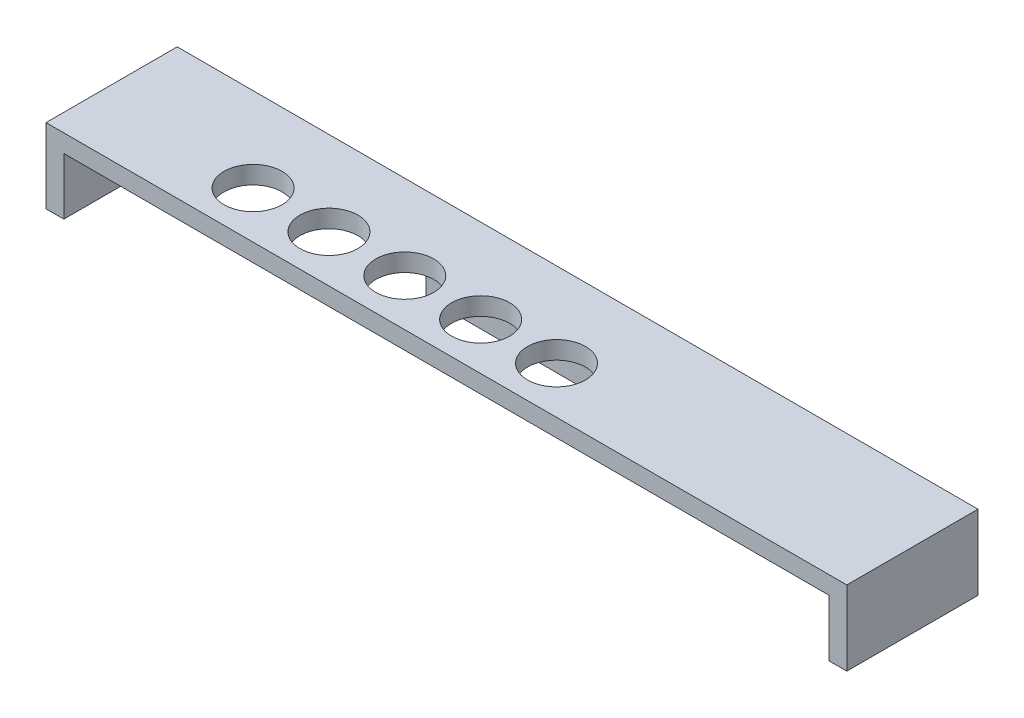
ISO-10303-21;
HEADER;
FILE_DESCRIPTION(('STEP AP214'),'2;1');
FILE_NAME('part.step','',(''),(''),'','','');
FILE_SCHEMA(('AUTOMOTIVE_DESIGN { 1 0 10303 214 1 1 1 1 }'));
ENDSEC;
DATA;
#1=APPLICATION_CONTEXT('core data for automotive mechanical design processes');
#2=APPLICATION_PROTOCOL_DEFINITION('international standard','automotive_design',2000,#1);
#3=PRODUCT_CONTEXT('',#1,'mechanical');
#4=PRODUCT('Part','Part','',(#3));
#5=PRODUCT_RELATED_PRODUCT_CATEGORY('part','',(#4));
#6=PRODUCT_DEFINITION_FORMATION('','',#4);
#7=PRODUCT_DEFINITION_CONTEXT('part definition',#1,'design');
#8=PRODUCT_DEFINITION('design','',#6,#7);
#9=PRODUCT_DEFINITION_SHAPE('','',#8);
#10=(LENGTH_UNIT() NAMED_UNIT(*) SI_UNIT(.MILLI.,.METRE.));
#11=(NAMED_UNIT(*) PLANE_ANGLE_UNIT() SI_UNIT($,.RADIAN.));
#12=(NAMED_UNIT(*) SI_UNIT($,.STERADIAN.) SOLID_ANGLE_UNIT());
#13=UNCERTAINTY_MEASURE_WITH_UNIT(LENGTH_MEASURE(1.E-05),#10,'distance_accuracy_value','');
#14=(GEOMETRIC_REPRESENTATION_CONTEXT(3) GLOBAL_UNCERTAINTY_ASSIGNED_CONTEXT((#13)) GLOBAL_UNIT_ASSIGNED_CONTEXT((#10,
#11,#12)) REPRESENTATION_CONTEXT('',''));
#15=CARTESIAN_POINT('',(0.,0.,0.));
#16=DIRECTION('',(0.,0.,1.));
#17=DIRECTION('',(1.,0.,0.));
#18=AXIS2_PLACEMENT_3D('',#15,#16,#17);
#19=CARTESIAN_POINT('',(0.,0.,0.));
#20=DIRECTION('',(0.,-1.,0.));
#21=DIRECTION('',(0.,0.,-1.));
#22=AXIS2_PLACEMENT_3D('',#19,#20,#21);
#23=PLANE('',#22);
#24=DIRECTION('',(1.,0.,0.));
#25=VECTOR('',#24,1.);
#26=CARTESIAN_POINT('',(87.725,0.,-12.7));
#27=LINE('',#26,#25);
#28=CARTESIAN_POINT('',(59.8625,0.,-12.7));
#29=VERTEX_POINT('',#28);
#30=CARTESIAN_POINT('',(87.725,0.,-12.7));
#31=VERTEX_POINT('',#30);
#32=EDGE_CURVE('E76',#29,#31,#27,.T.);
#33=ORIENTED_EDGE('',*,*,#32,.F.);
#34=DIRECTION('',(0.,0.,1.));
#35=VECTOR('',#34,1.);
#36=CARTESIAN_POINT('',(59.8625,0.,-14.7));
#37=LINE('',#36,#35);
#38=CARTESIAN_POINT('',(59.8625,0.,-14.7));
#39=VERTEX_POINT('',#38);
#40=EDGE_CURVE('E172',#39,#29,#37,.T.);
#41=ORIENTED_EDGE('',*,*,#40,.F.);
#42=DIRECTION('',(-1.,0.,0.));
#43=VECTOR('',#42,1.);
#44=CARTESIAN_POINT('',(0.,0.,-14.7));
#45=LINE('',#44,#43);
#46=CARTESIAN_POINT('',(87.725,0.,-14.7));
#47=VERTEX_POINT('',#46);
#48=EDGE_CURVE('E268',#47,#39,#45,.T.);
#49=ORIENTED_EDGE('',*,*,#48,.F.);
#50=DIRECTION('',(0.,0.,-1.));
#51=VECTOR('',#50,1.);
#52=CARTESIAN_POINT('',(87.725,0.,-14.7));
#53=LINE('',#52,#51);
#54=EDGE_CURVE('E11',#31,#47,#53,.T.);
#55=ORIENTED_EDGE('',*,*,#54,.F.);
#56=EDGE_LOOP('',(#33,#41,#49,#55));
#57=FACE_BOUND('',#56,.T.);
#58=ADVANCED_FACE('F38',(#57),#23,.T.);
#59=CARTESIAN_POINT('',(29.8625,0.,-14.7));
#60=VERTEX_POINT('',#59);
#61=CARTESIAN_POINT('',(2.,0.,-14.7));
#62=VERTEX_POINT('',#61);
#63=EDGE_CURVE('E278',#60,#62,#45,.T.);
#64=ORIENTED_EDGE('',*,*,#63,.F.);
#65=DIRECTION('',(0.,0.,-1.));
#66=VECTOR('',#65,1.);
#67=CARTESIAN_POINT('',(29.8625,0.,-14.7));
#68=LINE('',#67,#66);
#69=CARTESIAN_POINT('',(29.8625,0.,-12.7));
#70=VERTEX_POINT('',#69);
#71=EDGE_CURVE('E168',#70,#60,#68,.T.);
#72=ORIENTED_EDGE('',*,*,#71,.F.);
#73=CARTESIAN_POINT('',(2.,0.,-12.7));
#74=VERTEX_POINT('',#73);
#75=EDGE_CURVE('E275',#74,#70,#27,.T.);
#76=ORIENTED_EDGE('',*,*,#75,.F.);
#77=DIRECTION('',(0.,0.,1.));
#78=VECTOR('',#77,1.);
#79=CARTESIAN_POINT('',(2.,0.,-14.7));
#80=LINE('',#79,#78);
#81=EDGE_CURVE('E173',#62,#74,#80,.T.);
#82=ORIENTED_EDGE('',*,*,#81,.F.);
#83=EDGE_LOOP('',(#64,#72,#76,#82));
#84=FACE_BOUND('',#83,.T.);
#85=ADVANCED_FACE('F313',(#84),#23,.T.);
#86=CARTESIAN_POINT('',(2.,3.96875,-12.7));
#87=DIRECTION('',(-1.,0.,0.));
#88=DIRECTION('',(0.,0.,1.));
#89=AXIS2_PLACEMENT_3D('',#86,#87,#88);
#90=PLANE('',#89);
#91=DIRECTION('',(0.,-1.,0.));
#92=VECTOR('',#91,1.);
#93=CARTESIAN_POINT('',(2.,3.96875,0.));
#94=LINE('',#93,#92);
#95=CARTESIAN_POINT('',(2.,3.96875,0.));
#96=VERTEX_POINT('',#95);
#97=CARTESIAN_POINT('',(2.,-2.4,0.));
#98=VERTEX_POINT('',#97);
#99=EDGE_CURVE('E42',#96,#98,#94,.T.);
#100=ORIENTED_EDGE('',*,*,#99,.T.);
#101=DIRECTION('',(0.,0.,1.));
#102=VECTOR('',#101,1.);
#103=CARTESIAN_POINT('',(2.,-2.4,-14.7));
#104=LINE('',#103,#102);
#105=CARTESIAN_POINT('',(2.,-2.4,-14.7));
#106=VERTEX_POINT('',#105);
#107=EDGE_CURVE('E185',#106,#98,#104,.T.);
#108=ORIENTED_EDGE('',*,*,#107,.F.);
#109=DIRECTION('',(0.,1.,0.));
#110=VECTOR('',#109,1.);
#111=CARTESIAN_POINT('',(2.,-2.4,-14.7));
#112=LINE('',#111,#110);
#113=EDGE_CURVE('E190',#106,#62,#112,.T.);
#114=ORIENTED_EDGE('',*,*,#113,.T.);
#115=ORIENTED_EDGE('',*,*,#81,.T.);
#116=DIRECTION('',(0.,-1.,0.));
#117=VECTOR('',#116,1.);
#118=CARTESIAN_POINT('',(2.,3.96875,-12.7));
#119=LINE('',#118,#117);
#120=CARTESIAN_POINT('',(2.,3.96875,-12.7));
#121=VERTEX_POINT('',#120);
#122=EDGE_CURVE('E289',#121,#74,#119,.T.);
#123=ORIENTED_EDGE('',*,*,#122,.F.);
#124=DIRECTION('',(0.,0.,-1.));
#125=VECTOR('',#124,1.);
#126=CARTESIAN_POINT('',(2.,3.96875,-12.7));
#127=LINE('',#126,#125);
#128=EDGE_CURVE('E264',#96,#121,#127,.T.);
#129=ORIENTED_EDGE('',*,*,#128,.F.);
#130=EDGE_LOOP('',(#100,#108,#114,#115,#123,#129));
#131=FACE_BOUND('',#130,.T.);
#132=ADVANCED_FACE('F40',(#131),#90,.F.);
#133=CARTESIAN_POINT('',(87.725,3.96875,-12.7));
#134=DIRECTION('',(0.,0.,-1.));
#135=DIRECTION('',(-1.,0.,0.));
#136=AXIS2_PLACEMENT_3D('',#133,#134,#135);
#137=PLANE('',#136);
#138=ORIENTED_EDGE('',*,*,#75,.T.);
#139=DIRECTION('',(0.,1.,0.));
#140=VECTOR('',#139,1.);
#141=CARTESIAN_POINT('',(29.8625,-2.4,-12.7));
#142=LINE('',#141,#140);
#143=CARTESIAN_POINT('',(29.8625,-2.4,-12.7));
#144=VERTEX_POINT('',#143);
#145=EDGE_CURVE('E157',#144,#70,#142,.T.);
#146=ORIENTED_EDGE('',*,*,#145,.F.);
#147=DIRECTION('',(-1.,0.,0.));
#148=VECTOR('',#147,1.);
#149=CARTESIAN_POINT('',(59.8625,-2.4,-12.7));
#150=LINE('',#149,#148);
#151=CARTESIAN_POINT('',(59.8625,-2.4,-12.7));
#152=VERTEX_POINT('',#151);
#153=EDGE_CURVE('E150',#152,#144,#150,.T.);
#154=ORIENTED_EDGE('',*,*,#153,.F.);
#155=DIRECTION('',(0.,1.,0.));
#156=VECTOR('',#155,1.);
#157=CARTESIAN_POINT('',(59.8625,-2.4,-12.7));
#158=LINE('',#157,#156);
#159=EDGE_CURVE('E155',#152,#29,#158,.T.);
#160=ORIENTED_EDGE('',*,*,#159,.T.);
#161=ORIENTED_EDGE('',*,*,#32,.T.);
#162=DIRECTION('',(0.,-1.,0.));
#163=VECTOR('',#162,1.);
#164=CARTESIAN_POINT('',(87.725,3.96875,-12.7));
#165=LINE('',#164,#163);
#166=CARTESIAN_POINT('',(87.725,3.96875,-12.7));
#167=VERTEX_POINT('',#166);
#168=EDGE_CURVE('E66',#167,#31,#165,.T.);
#169=ORIENTED_EDGE('',*,*,#168,.F.);
#170=DIRECTION('',(1.,0.,0.));
#171=VECTOR('',#170,1.);
#172=CARTESIAN_POINT('',(87.725,3.96875,-12.7));
#173=LINE('',#172,#171);
#174=EDGE_CURVE('E267',#121,#167,#173,.T.);
#175=ORIENTED_EDGE('',*,*,#174,.F.);
#176=ORIENTED_EDGE('',*,*,#122,.T.);
#177=EDGE_LOOP('',(#138,#146,#154,#160,#161,#169,#175,#176));
#178=FACE_BOUND('',#177,.T.);
#179=ADVANCED_FACE('F153',(#178),#137,.F.);
#180=CARTESIAN_POINT('',(87.725,3.96875,0.));
#181=DIRECTION('',(1.,0.,0.));
#182=DIRECTION('',(0.,0.,-1.));
#183=AXIS2_PLACEMENT_3D('',#180,#181,#182);
#184=PLANE('',#183);
#185=ORIENTED_EDGE('',*,*,#168,.T.);
#186=ORIENTED_EDGE('',*,*,#54,.T.);
#187=DIRECTION('',(0.,1.,0.));
#188=VECTOR('',#187,1.);
#189=CARTESIAN_POINT('',(87.725,-2.4,-14.7));
#190=LINE('',#189,#188);
#191=CARTESIAN_POINT('',(87.725,-2.4,-14.7));
#192=VERTEX_POINT('',#191);
#193=EDGE_CURVE('E204',#192,#47,#190,.T.);
#194=ORIENTED_EDGE('',*,*,#193,.F.);
#195=DIRECTION('',(0.,0.,-1.));
#196=VECTOR('',#195,1.);
#197=CARTESIAN_POINT('',(87.725,-2.4,-14.7));
#198=LINE('',#197,#196);
#199=CARTESIAN_POINT('',(87.725,-2.4,0.));
#200=VERTEX_POINT('',#199);
#201=EDGE_CURVE('E200',#200,#192,#198,.T.);
#202=ORIENTED_EDGE('',*,*,#201,.F.);
#203=DIRECTION('',(0.,-1.,0.));
#204=VECTOR('',#203,1.);
#205=CARTESIAN_POINT('',(87.725,3.96875,0.));
#206=LINE('',#205,#204);
#207=CARTESIAN_POINT('',(87.725,3.96875,0.));
#208=VERTEX_POINT('',#207);
#209=EDGE_CURVE('E85',#208,#200,#206,.T.);
#210=ORIENTED_EDGE('',*,*,#209,.F.);
#211=DIRECTION('',(0.,0.,1.));
#212=VECTOR('',#211,1.);
#213=CARTESIAN_POINT('',(87.725,3.96875,0.));
#214=LINE('',#213,#212);
#215=EDGE_CURVE('E272',#167,#208,#214,.T.);
#216=ORIENTED_EDGE('',*,*,#215,.F.);
#217=EDGE_LOOP('',(#185,#186,#194,#202,#210,#216));
#218=FACE_BOUND('',#217,.T.);
#219=ADVANCED_FACE('F331',(#218),#184,.F.);
#220=CARTESIAN_POINT('',(89.725,3.96875,0.));
#221=DIRECTION('',(0.,0.,-1.));
#222=DIRECTION('',(-1.,0.,0.));
#223=AXIS2_PLACEMENT_3D('',#220,#221,#222);
#224=PLANE('',#223);
#225=ORIENTED_EDGE('',*,*,#209,.T.);
#226=DIRECTION('',(-1.,0.,0.));
#227=VECTOR('',#226,1.);
#228=CARTESIAN_POINT('',(89.725,-2.4,0.));
#229=LINE('',#228,#227);
#230=CARTESIAN_POINT('',(89.725,-2.4,0.));
#231=VERTEX_POINT('',#230);
#232=EDGE_CURVE('E197',#231,#200,#229,.T.);
#233=ORIENTED_EDGE('',*,*,#232,.F.);
#234=DIRECTION('',(0.,-1.,0.));
#235=VECTOR('',#234,1.);
#236=CARTESIAN_POINT('',(89.725,3.96875,0.));
#237=LINE('',#236,#235);
#238=CARTESIAN_POINT('',(89.725,5.96875,0.));
#239=VERTEX_POINT('',#238);
#240=EDGE_CURVE('E286',#239,#231,#237,.T.);
#241=ORIENTED_EDGE('',*,*,#240,.F.);
#242=DIRECTION('',(1.,0.,0.));
#243=VECTOR('',#242,1.);
#244=CARTESIAN_POINT('',(0.,5.96875,0.));
#245=LINE('',#244,#243);
#246=CARTESIAN_POINT('',(0.,5.96875,0.));
#247=VERTEX_POINT('',#246);
#248=EDGE_CURVE('E250',#247,#239,#245,.T.);
#249=ORIENTED_EDGE('',*,*,#248,.F.);
#250=DIRECTION('',(0.,-1.,0.));
#251=VECTOR('',#250,1.);
#252=CARTESIAN_POINT('',(0.,3.96875,0.));
#253=LINE('',#252,#251);
#254=CARTESIAN_POINT('',(0.,-2.4,0.));
#255=VERTEX_POINT('',#254);
#256=EDGE_CURVE('E274',#247,#255,#253,.T.);
#257=ORIENTED_EDGE('',*,*,#256,.T.);
#258=DIRECTION('',(-1.,0.,0.));
#259=VECTOR('',#258,1.);
#260=CARTESIAN_POINT('',(0.,-2.4,0.));
#261=LINE('',#260,#259);
#262=EDGE_CURVE('E188',#98,#255,#261,.T.);
#263=ORIENTED_EDGE('',*,*,#262,.F.);
#264=ORIENTED_EDGE('',*,*,#99,.F.);
#265=DIRECTION('',(1.,0.,0.));
#266=VECTOR('',#265,1.);
#267=CARTESIAN_POINT('',(0.,3.96875,0.));
#268=LINE('',#267,#266);
#269=EDGE_CURVE('E246',#96,#208,#268,.T.);
#270=ORIENTED_EDGE('',*,*,#269,.T.);
#271=EDGE_LOOP('',(#225,#233,#241,#249,#257,#263,#264,#270));
#272=FACE_BOUND('',#271,.T.);
#273=ADVANCED_FACE('F303',(#272),#224,.F.);
#274=CARTESIAN_POINT('',(89.725,3.96875,-14.7));
#275=DIRECTION('',(-1.,0.,0.));
#276=DIRECTION('',(0.,0.,1.));
#277=AXIS2_PLACEMENT_3D('',#274,#275,#276);
#278=PLANE('',#277);
#279=ORIENTED_EDGE('',*,*,#240,.T.);
#280=DIRECTION('',(0.,0.,1.));
#281=VECTOR('',#280,1.);
#282=CARTESIAN_POINT('',(89.725,-2.4,-14.7));
#283=LINE('',#282,#281);
#284=CARTESIAN_POINT('',(89.725,-2.4,-14.7));
#285=VERTEX_POINT('',#284);
#286=EDGE_CURVE('E194',#285,#231,#283,.T.);
#287=ORIENTED_EDGE('',*,*,#286,.F.);
#288=DIRECTION('',(0.,-1.,0.));
#289=VECTOR('',#288,1.);
#290=CARTESIAN_POINT('',(89.725,3.96875,-14.7));
#291=LINE('',#290,#289);
#292=CARTESIAN_POINT('',(89.725,5.96875,-14.7));
#293=VERTEX_POINT('',#292);
#294=EDGE_CURVE('E284',#293,#285,#291,.T.);
#295=ORIENTED_EDGE('',*,*,#294,.F.);
#296=DIRECTION('',(0.,0.,-1.));
#297=VECTOR('',#296,1.);
#298=CARTESIAN_POINT('',(89.725,5.96875,-14.7));
#299=LINE('',#298,#297);
#300=EDGE_CURVE('E254',#239,#293,#299,.T.);
#301=ORIENTED_EDGE('',*,*,#300,.F.);
#302=EDGE_LOOP('',(#279,#287,#295,#301));
#303=FACE_BOUND('',#302,.T.);
#304=ADVANCED_FACE('F339',(#303),#278,.F.);
#305=CARTESIAN_POINT('',(0.,3.96875,-14.7));
#306=DIRECTION('',(0.,0.,1.));
#307=DIRECTION('',(1.,0.,0.));
#308=AXIS2_PLACEMENT_3D('',#305,#306,#307);
#309=PLANE('',#308);
#310=ORIENTED_EDGE('',*,*,#294,.T.);
#311=DIRECTION('',(1.,0.,0.));
#312=VECTOR('',#311,1.);
#313=CARTESIAN_POINT('',(89.725,-2.4,-14.7));
#314=LINE('',#313,#312);
#315=EDGE_CURVE('E202',#192,#285,#314,.T.);
#316=ORIENTED_EDGE('',*,*,#315,.F.);
#317=ORIENTED_EDGE('',*,*,#193,.T.);
#318=ORIENTED_EDGE('',*,*,#48,.T.);
#319=DIRECTION('',(0.,1.,0.));
#320=VECTOR('',#319,1.);
#321=CARTESIAN_POINT('',(59.8625,-2.4,-14.7));
#322=LINE('',#321,#320);
#323=CARTESIAN_POINT('',(59.8625,-2.4,-14.7));
#324=VERTEX_POINT('',#323);
#325=EDGE_CURVE('E323',#324,#39,#322,.T.);
#326=ORIENTED_EDGE('',*,*,#325,.F.);
#327=DIRECTION('',(1.,0.,0.));
#328=VECTOR('',#327,1.);
#329=CARTESIAN_POINT('',(59.8625,-2.4,-14.7));
#330=LINE('',#329,#328);
#331=CARTESIAN_POINT('',(29.8625,-2.4,-14.7));
#332=VERTEX_POINT('',#331);
#333=EDGE_CURVE('E165',#332,#324,#330,.T.);
#334=ORIENTED_EDGE('',*,*,#333,.F.);
#335=DIRECTION('',(0.,1.,0.));
#336=VECTOR('',#335,1.);
#337=CARTESIAN_POINT('',(29.8625,-2.4,-14.7));
#338=LINE('',#337,#336);
#339=EDGE_CURVE('E57',#332,#60,#338,.T.);
#340=ORIENTED_EDGE('',*,*,#339,.T.);
#341=ORIENTED_EDGE('',*,*,#63,.T.);
#342=ORIENTED_EDGE('',*,*,#113,.F.);
#343=DIRECTION('',(1.,0.,0.));
#344=VECTOR('',#343,1.);
#345=CARTESIAN_POINT('',(0.,-2.4,-14.7));
#346=LINE('',#345,#344);
#347=CARTESIAN_POINT('',(0.,-2.4,-14.7));
#348=VERTEX_POINT('',#347);
#349=EDGE_CURVE('E183',#348,#106,#346,.T.);
#350=ORIENTED_EDGE('',*,*,#349,.F.);
#351=DIRECTION('',(0.,-1.,0.));
#352=VECTOR('',#351,1.);
#353=CARTESIAN_POINT('',(0.,3.96875,-14.7));
#354=LINE('',#353,#352);
#355=CARTESIAN_POINT('',(0.,5.96875,-14.7));
#356=VERTEX_POINT('',#355);
#357=EDGE_CURVE('E282',#356,#348,#354,.T.);
#358=ORIENTED_EDGE('',*,*,#357,.F.);
#359=DIRECTION('',(-1.,0.,0.));
#360=VECTOR('',#359,1.);
#361=CARTESIAN_POINT('',(0.,5.96875,-14.7));
#362=LINE('',#361,#360);
#363=EDGE_CURVE('E257',#293,#356,#362,.T.);
#364=ORIENTED_EDGE('',*,*,#363,.F.);
#365=EDGE_LOOP('',(#310,#316,#317,#318,#326,#334,#340,#341,#342,#350,#358,#364));
#366=FACE_BOUND('',#365,.T.);
#367=ADVANCED_FACE('F309',(#366),#309,.F.);
#368=CARTESIAN_POINT('',(0.,3.96875,0.));
#369=DIRECTION('',(1.,0.,0.));
#370=DIRECTION('',(0.,0.,-1.));
#371=AXIS2_PLACEMENT_3D('',#368,#369,#370);
#372=PLANE('',#371);
#373=ORIENTED_EDGE('',*,*,#357,.T.);
#374=DIRECTION('',(0.,0.,-1.));
#375=VECTOR('',#374,1.);
#376=CARTESIAN_POINT('',(0.,-2.4,-14.7));
#377=LINE('',#376,#375);
#378=EDGE_CURVE('E175',#255,#348,#377,.T.);
#379=ORIENTED_EDGE('',*,*,#378,.F.);
#380=ORIENTED_EDGE('',*,*,#256,.F.);
#381=DIRECTION('',(0.,0.,1.));
#382=VECTOR('',#381,1.);
#383=CARTESIAN_POINT('',(0.,5.96875,-14.7));
#384=LINE('',#383,#382);
#385=EDGE_CURVE('E247',#356,#247,#384,.T.);
#386=ORIENTED_EDGE('',*,*,#385,.F.);
#387=EDGE_LOOP('',(#373,#379,#380,#386));
#388=FACE_BOUND('',#387,.T.);
#389=ADVANCED_FACE('F307',(#388),#372,.F.);
#390=CARTESIAN_POINT('',(0.,3.96875,0.));
#391=DIRECTION('',(0.,1.,0.));
#392=DIRECTION('',(0.,0.,1.));
#393=AXIS2_PLACEMENT_3D('',#390,#391,#392);
#394=PLANE('',#393);
#395=CARTESIAN_POINT('',(17.95,3.96875,-5.25000000000001));
#396=DIRECTION('',(0.,1.,0.));
#397=DIRECTION('',(0.,0.,1.));
#398=AXIS2_PLACEMENT_3D('',#395,#396,#397);
#399=CIRCLE('',#398,3.25);
#400=CARTESIAN_POINT('',(17.95,3.96875,-2.00000000000001));
#401=VERTEX_POINT('',#400);
#402=EDGE_CURVE('E243',#401,#401,#399,.T.);
#403=ORIENTED_EDGE('',*,*,#402,.T.);
#404=EDGE_LOOP('',(#403));
#405=FACE_BOUND('',#404,.T.);
#406=CARTESIAN_POINT('',(26.45,3.96875,-5.25000000000001));
#407=DIRECTION('',(0.,1.,0.));
#408=DIRECTION('',(0.,0.,1.));
#409=AXIS2_PLACEMENT_3D('',#406,#407,#408);
#410=CIRCLE('',#409,3.25);
#411=CARTESIAN_POINT('',(26.45,3.96875,-2.00000000000001));
#412=VERTEX_POINT('',#411);
#413=EDGE_CURVE('E239',#412,#412,#410,.T.);
#414=ORIENTED_EDGE('',*,*,#413,.T.);
#415=EDGE_LOOP('',(#414));
#416=FACE_BOUND('',#415,.T.);
#417=CARTESIAN_POINT('',(34.95,3.96875,-5.25000000000001));
#418=DIRECTION('',(0.,1.,0.));
#419=DIRECTION('',(0.,0.,1.));
#420=AXIS2_PLACEMENT_3D('',#417,#418,#419);
#421=CIRCLE('',#420,3.25);
#422=CARTESIAN_POINT('',(34.95,3.96875,-2.00000000000001));
#423=VERTEX_POINT('',#422);
#424=EDGE_CURVE('E235',#423,#423,#421,.T.);
#425=ORIENTED_EDGE('',*,*,#424,.T.);
#426=EDGE_LOOP('',(#425));
#427=FACE_BOUND('',#426,.T.);
#428=CARTESIAN_POINT('',(43.45,3.96875,-5.25000000000001));
#429=DIRECTION('',(0.,1.,0.));
#430=DIRECTION('',(0.,0.,1.));
#431=AXIS2_PLACEMENT_3D('',#428,#429,#430);
#432=CIRCLE('',#431,3.25);
#433=CARTESIAN_POINT('',(43.45,3.96875,-2.00000000000001));
#434=VERTEX_POINT('',#433);
#435=EDGE_CURVE('E231',#434,#434,#432,.T.);
#436=ORIENTED_EDGE('',*,*,#435,.T.);
#437=EDGE_LOOP('',(#436));
#438=FACE_BOUND('',#437,.T.);
#439=CARTESIAN_POINT('',(51.95,3.96875,-5.25000000000001));
#440=DIRECTION('',(0.,1.,0.));
#441=DIRECTION('',(0.,0.,1.));
#442=AXIS2_PLACEMENT_3D('',#439,#440,#441);
#443=CIRCLE('',#442,3.25);
#444=CARTESIAN_POINT('',(51.95,3.96875,-2.00000000000001));
#445=VERTEX_POINT('',#444);
#446=EDGE_CURVE('E212',#445,#445,#443,.T.);
#447=ORIENTED_EDGE('',*,*,#446,.T.);
#448=EDGE_LOOP('',(#447));
#449=FACE_BOUND('',#448,.T.);
#450=ORIENTED_EDGE('',*,*,#269,.F.);
#451=ORIENTED_EDGE('',*,*,#128,.T.);
#452=ORIENTED_EDGE('',*,*,#174,.T.);
#453=ORIENTED_EDGE('',*,*,#215,.T.);
#454=EDGE_LOOP('',(#450,#451,#452,#453));
#455=FACE_BOUND('',#454,.T.);
#456=ADVANCED_FACE('F333',(#405,#416,#427,#438,#449,#455),#394,.F.);
#457=CARTESIAN_POINT('',(0.,5.96875,0.));
#458=DIRECTION('',(0.,1.,0.));
#459=DIRECTION('',(0.,0.,1.));
#460=AXIS2_PLACEMENT_3D('',#457,#458,#459);
#461=PLANE('',#460);
#462=CARTESIAN_POINT('',(17.95,5.96875,-5.25000000000001));
#463=DIRECTION('',(0.,1.,0.));
#464=DIRECTION('',(0.,0.,1.));
#465=AXIS2_PLACEMENT_3D('',#462,#463,#464);
#466=CIRCLE('',#465,3.25);
#467=CARTESIAN_POINT('',(17.95,5.96875,-2.00000000000001));
#468=VERTEX_POINT('',#467);
#469=EDGE_CURVE('E209',#468,#468,#466,.T.);
#470=ORIENTED_EDGE('',*,*,#469,.F.);
#471=EDGE_LOOP('',(#470));
#472=FACE_BOUND('',#471,.T.);
#473=CARTESIAN_POINT('',(26.45,5.96875,-5.25000000000001));
#474=DIRECTION('',(0.,1.,0.));
#475=DIRECTION('',(0.,0.,1.));
#476=AXIS2_PLACEMENT_3D('',#473,#474,#475);
#477=CIRCLE('',#476,3.25);
#478=CARTESIAN_POINT('',(26.45,5.96875,-2.00000000000001));
#479=VERTEX_POINT('',#478);
#480=EDGE_CURVE('E213',#479,#479,#477,.T.);
#481=ORIENTED_EDGE('',*,*,#480,.F.);
#482=EDGE_LOOP('',(#481));
#483=FACE_BOUND('',#482,.T.);
#484=CARTESIAN_POINT('',(34.95,5.96875,-5.25000000000001));
#485=DIRECTION('',(0.,1.,0.));
#486=DIRECTION('',(0.,0.,1.));
#487=AXIS2_PLACEMENT_3D('',#484,#485,#486);
#488=CIRCLE('',#487,3.25);
#489=CARTESIAN_POINT('',(34.95,5.96875,-2.00000000000001));
#490=VERTEX_POINT('',#489);
#491=EDGE_CURVE('E217',#490,#490,#488,.T.);
#492=ORIENTED_EDGE('',*,*,#491,.F.);
#493=EDGE_LOOP('',(#492));
#494=FACE_BOUND('',#493,.T.);
#495=CARTESIAN_POINT('',(43.45,5.96875,-5.25000000000001));
#496=DIRECTION('',(0.,1.,0.));
#497=DIRECTION('',(0.,0.,1.));
#498=AXIS2_PLACEMENT_3D('',#495,#496,#497);
#499=CIRCLE('',#498,3.25);
#500=CARTESIAN_POINT('',(43.45,5.96875,-2.00000000000001));
#501=VERTEX_POINT('',#500);
#502=EDGE_CURVE('E221',#501,#501,#499,.T.);
#503=ORIENTED_EDGE('',*,*,#502,.F.);
#504=EDGE_LOOP('',(#503));
#505=FACE_BOUND('',#504,.T.);
#506=CARTESIAN_POINT('',(51.95,5.96875,-5.25000000000001));
#507=DIRECTION('',(0.,1.,0.));
#508=DIRECTION('',(0.,0.,1.));
#509=AXIS2_PLACEMENT_3D('',#506,#507,#508);
#510=CIRCLE('',#509,3.25);
#511=CARTESIAN_POINT('',(51.95,5.96875,-2.00000000000001));
#512=VERTEX_POINT('',#511);
#513=EDGE_CURVE('E208',#512,#512,#510,.T.);
#514=ORIENTED_EDGE('',*,*,#513,.F.);
#515=EDGE_LOOP('',(#514));
#516=FACE_BOUND('',#515,.T.);
#517=ORIENTED_EDGE('',*,*,#385,.T.);
#518=ORIENTED_EDGE('',*,*,#248,.T.);
#519=ORIENTED_EDGE('',*,*,#300,.T.);
#520=ORIENTED_EDGE('',*,*,#363,.T.);
#521=EDGE_LOOP('',(#517,#518,#519,#520));
#522=FACE_BOUND('',#521,.T.);
#523=ADVANCED_FACE('F342',(#472,#483,#494,#505,#516,#522),#461,.T.);
#524=CARTESIAN_POINT('',(51.95,0.,-5.25000000000001));
#525=DIRECTION('',(0.,1.,0.));
#526=DIRECTION('',(0.,0.,1.));
#527=AXIS2_PLACEMENT_3D('',#524,#525,#526);
#528=CYLINDRICAL_SURFACE('',#527,3.25);
#529=ORIENTED_EDGE('',*,*,#513,.T.);
#530=EDGE_LOOP('',(#529));
#531=FACE_BOUND('',#530,.T.);
#532=ORIENTED_EDGE('',*,*,#446,.F.);
#533=EDGE_LOOP('',(#532));
#534=FACE_BOUND('',#533,.T.);
#535=ADVANCED_FACE('F344',(#531,#534),#528,.F.);
#536=CARTESIAN_POINT('',(43.45,0.,-5.25000000000001));
#537=DIRECTION('',(0.,1.,0.));
#538=DIRECTION('',(0.,0.,1.));
#539=AXIS2_PLACEMENT_3D('',#536,#537,#538);
#540=CYLINDRICAL_SURFACE('',#539,3.25);
#541=ORIENTED_EDGE('',*,*,#502,.T.);
#542=EDGE_LOOP('',(#541));
#543=FACE_BOUND('',#542,.T.);
#544=ORIENTED_EDGE('',*,*,#435,.F.);
#545=EDGE_LOOP('',(#544));
#546=FACE_BOUND('',#545,.T.);
#547=ADVANCED_FACE('F351',(#543,#546),#540,.F.);
#548=CARTESIAN_POINT('',(34.95,0.,-5.25000000000001));
#549=DIRECTION('',(0.,1.,0.));
#550=DIRECTION('',(0.,0.,1.));
#551=AXIS2_PLACEMENT_3D('',#548,#549,#550);
#552=CYLINDRICAL_SURFACE('',#551,3.25);
#553=ORIENTED_EDGE('',*,*,#491,.T.);
#554=EDGE_LOOP('',(#553));
#555=FACE_BOUND('',#554,.T.);
#556=ORIENTED_EDGE('',*,*,#424,.F.);
#557=EDGE_LOOP('',(#556));
#558=FACE_BOUND('',#557,.T.);
#559=ADVANCED_FACE('F408',(#555,#558),#552,.F.);
#560=CARTESIAN_POINT('',(26.45,0.,-5.25000000000001));
#561=DIRECTION('',(0.,1.,0.));
#562=DIRECTION('',(0.,0.,1.));
#563=AXIS2_PLACEMENT_3D('',#560,#561,#562);
#564=CYLINDRICAL_SURFACE('',#563,3.25);
#565=ORIENTED_EDGE('',*,*,#480,.T.);
#566=EDGE_LOOP('',(#565));
#567=FACE_BOUND('',#566,.T.);
#568=ORIENTED_EDGE('',*,*,#413,.F.);
#569=EDGE_LOOP('',(#568));
#570=FACE_BOUND('',#569,.T.);
#571=ADVANCED_FACE('F397',(#567,#570),#564,.F.);
#572=CARTESIAN_POINT('',(17.95,0.,-5.25000000000001));
#573=DIRECTION('',(0.,1.,0.));
#574=DIRECTION('',(0.,0.,1.));
#575=AXIS2_PLACEMENT_3D('',#572,#573,#574);
#576=CYLINDRICAL_SURFACE('',#575,3.25);
#577=ORIENTED_EDGE('',*,*,#469,.T.);
#578=EDGE_LOOP('',(#577));
#579=FACE_BOUND('',#578,.T.);
#580=ORIENTED_EDGE('',*,*,#402,.F.);
#581=EDGE_LOOP('',(#580));
#582=FACE_BOUND('',#581,.T.);
#583=ADVANCED_FACE('F393',(#579,#582),#576,.F.);
#584=CARTESIAN_POINT('',(0.,-2.4,0.));
#585=DIRECTION('',(0.,-1.,0.));
#586=DIRECTION('',(0.,0.,-1.));
#587=AXIS2_PLACEMENT_3D('',#584,#585,#586);
#588=PLANE('',#587);
#589=ORIENTED_EDGE('',*,*,#286,.T.);
#590=ORIENTED_EDGE('',*,*,#232,.T.);
#591=ORIENTED_EDGE('',*,*,#201,.T.);
#592=ORIENTED_EDGE('',*,*,#315,.T.);
#593=EDGE_LOOP('',(#589,#590,#591,#592));
#594=FACE_BOUND('',#593,.T.);
#595=ADVANCED_FACE('F336',(#594),#588,.T.);
#596=CARTESIAN_POINT('',(0.,-2.4,0.));
#597=DIRECTION('',(0.,1.,0.));
#598=DIRECTION('',(0.,0.,1.));
#599=AXIS2_PLACEMENT_3D('',#596,#597,#598);
#600=PLANE('',#599);
#601=ORIENTED_EDGE('',*,*,#378,.T.);
#602=ORIENTED_EDGE('',*,*,#349,.T.);
#603=ORIENTED_EDGE('',*,*,#107,.T.);
#604=ORIENTED_EDGE('',*,*,#262,.T.);
#605=EDGE_LOOP('',(#601,#602,#603,#604));
#606=FACE_BOUND('',#605,.T.);
#607=ADVANCED_FACE('F299',(#606),#600,.F.);
#608=CARTESIAN_POINT('',(59.8625,-2.4,-14.7));
#609=DIRECTION('',(-1.,0.,0.));
#610=DIRECTION('',(0.,0.,1.));
#611=AXIS2_PLACEMENT_3D('',#608,#609,#610);
#612=PLANE('',#611);
#613=ORIENTED_EDGE('',*,*,#40,.T.);
#614=ORIENTED_EDGE('',*,*,#159,.F.);
#615=DIRECTION('',(0.,0.,1.));
#616=VECTOR('',#615,1.);
#617=CARTESIAN_POINT('',(59.8625,-2.4,-14.7));
#618=LINE('',#617,#616);
#619=EDGE_CURVE('E161',#324,#152,#618,.T.);
#620=ORIENTED_EDGE('',*,*,#619,.F.);
#621=ORIENTED_EDGE('',*,*,#325,.T.);
#622=EDGE_LOOP('',(#613,#614,#620,#621));
#623=FACE_BOUND('',#622,.T.);
#624=ADVANCED_FACE('F170',(#623),#612,.F.);
#625=CARTESIAN_POINT('',(29.8625,-2.4,-14.7));
#626=DIRECTION('',(1.,0.,0.));
#627=DIRECTION('',(0.,0.,-1.));
#628=AXIS2_PLACEMENT_3D('',#625,#626,#627);
#629=PLANE('',#628);
#630=ORIENTED_EDGE('',*,*,#71,.T.);
#631=ORIENTED_EDGE('',*,*,#339,.F.);
#632=DIRECTION('',(0.,0.,-1.));
#633=VECTOR('',#632,1.);
#634=CARTESIAN_POINT('',(29.8625,-2.4,-14.7));
#635=LINE('',#634,#633);
#636=EDGE_CURVE('E160',#144,#332,#635,.T.);
#637=ORIENTED_EDGE('',*,*,#636,.F.);
#638=ORIENTED_EDGE('',*,*,#145,.T.);
#639=EDGE_LOOP('',(#630,#631,#637,#638));
#640=FACE_BOUND('',#639,.T.);
#641=ADVANCED_FACE('F327',(#640),#629,.F.);
#642=CARTESIAN_POINT('',(0.,-2.4,0.));
#643=DIRECTION('',(0.,-1.,0.));
#644=DIRECTION('',(0.,0.,-1.));
#645=AXIS2_PLACEMENT_3D('',#642,#643,#644);
#646=PLANE('',#645);
#647=ORIENTED_EDGE('',*,*,#619,.T.);
#648=ORIENTED_EDGE('',*,*,#153,.T.);
#649=ORIENTED_EDGE('',*,*,#636,.T.);
#650=ORIENTED_EDGE('',*,*,#333,.T.);
#651=EDGE_LOOP('',(#647,#648,#649,#650));
#652=FACE_BOUND('',#651,.T.);
#653=ADVANCED_FACE('F164',(#652),#646,.T.);
#654=CLOSED_SHELL('',(#58,#85,#132,#179,#219,#273,#304,#367,#389,#456,#523,#535,#547,#559,#571,
#583,#595,#607,#624,#641,#653));
#655=MANIFOLD_SOLID_BREP('B2',#654);
#656=ADVANCED_BREP_SHAPE_REPRESENTATION('',(#18,#655),#14);
#657=SHAPE_DEFINITION_REPRESENTATION(#9,#656);
ENDSEC;
END-ISO-10303-21;
